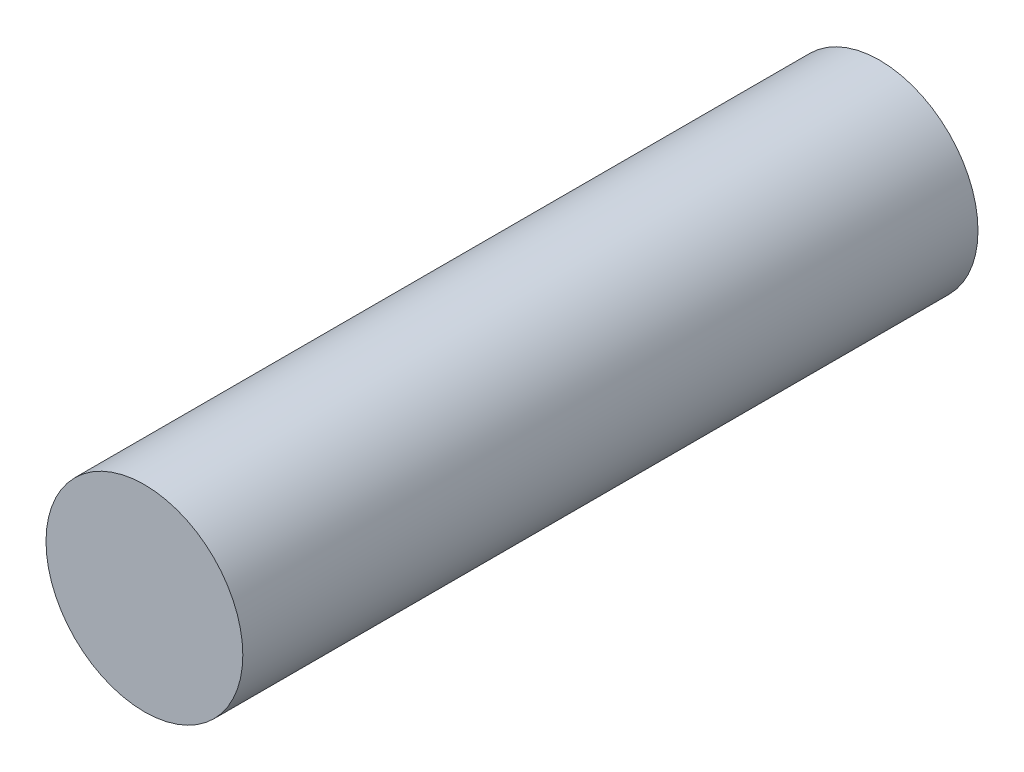
ISO-10303-21;
HEADER;
FILE_DESCRIPTION(('STEP AP214'),'2;1');
FILE_NAME('part.step','',(''),(''),'','','');
FILE_SCHEMA(('AUTOMOTIVE_DESIGN { 1 0 10303 214 1 1 1 1 }'));
ENDSEC;
DATA;
#1=APPLICATION_CONTEXT('core data for automotive mechanical design processes');
#2=APPLICATION_PROTOCOL_DEFINITION('international standard','automotive_design',2000,#1);
#3=PRODUCT_CONTEXT('',#1,'mechanical');
#4=PRODUCT('Part','Part','',(#3));
#5=PRODUCT_RELATED_PRODUCT_CATEGORY('part','',(#4));
#6=PRODUCT_DEFINITION_FORMATION('','',#4);
#7=PRODUCT_DEFINITION_CONTEXT('part definition',#1,'design');
#8=PRODUCT_DEFINITION('design','',#6,#7);
#9=PRODUCT_DEFINITION_SHAPE('','',#8);
#10=(LENGTH_UNIT() NAMED_UNIT(*) SI_UNIT(.MILLI.,.METRE.));
#11=(NAMED_UNIT(*) PLANE_ANGLE_UNIT() SI_UNIT($,.RADIAN.));
#12=(NAMED_UNIT(*) SI_UNIT($,.STERADIAN.) SOLID_ANGLE_UNIT());
#13=UNCERTAINTY_MEASURE_WITH_UNIT(LENGTH_MEASURE(1.E-05),#10,'distance_accuracy_value','');
#14=(GEOMETRIC_REPRESENTATION_CONTEXT(3) GLOBAL_UNCERTAINTY_ASSIGNED_CONTEXT((#13)) GLOBAL_UNIT_ASSIGNED_CONTEXT((#10,
#11,#12)) REPRESENTATION_CONTEXT('',''));
#15=CARTESIAN_POINT('',(0.,0.,0.));
#16=DIRECTION('',(0.,0.,1.));
#17=DIRECTION('',(1.,0.,0.));
#18=AXIS2_PLACEMENT_3D('',#15,#16,#17);
#19=CARTESIAN_POINT('',(0.,0.,63.5));
#20=DIRECTION('',(0.,0.,-1.));
#21=DIRECTION('',(-1.,0.,0.));
#22=AXIS2_PLACEMENT_3D('',#19,#20,#21);
#23=CYLINDRICAL_SURFACE('',#22,8.5);
#24=CARTESIAN_POINT('',(0.,0.,63.5));
#25=DIRECTION('',(0.,0.,1.));
#26=DIRECTION('',(1.,0.,0.));
#27=AXIS2_PLACEMENT_3D('',#24,#25,#26);
#28=CIRCLE('',#27,8.5);
#29=CARTESIAN_POINT('',(8.5,0.,63.5));
#30=VERTEX_POINT('',#29);
#31=EDGE_CURVE('E10',#30,#30,#28,.T.);
#32=ORIENTED_EDGE('',*,*,#31,.F.);
#33=EDGE_LOOP('',(#32));
#34=FACE_BOUND('',#33,.T.);
#35=CARTESIAN_POINT('',(0.,0.,0.));
#36=DIRECTION('',(0.,0.,1.));
#37=DIRECTION('',(1.,0.,0.));
#38=AXIS2_PLACEMENT_3D('',#35,#36,#37);
#39=CIRCLE('',#38,8.5);
#40=CARTESIAN_POINT('',(8.5,0.,0.));
#41=VERTEX_POINT('',#40);
#42=EDGE_CURVE('E34',#41,#41,#39,.T.);
#43=ORIENTED_EDGE('',*,*,#42,.T.);
#44=EDGE_LOOP('',(#43));
#45=FACE_BOUND('',#44,.T.);
#46=ADVANCED_FACE('F31',(#34,#45),#23,.T.);
#47=CARTESIAN_POINT('',(0.,0.,63.5));
#48=DIRECTION('',(0.,0.,1.));
#49=DIRECTION('',(1.,0.,0.));
#50=AXIS2_PLACEMENT_3D('',#47,#48,#49);
#51=PLANE('',#50);
#52=ORIENTED_EDGE('',*,*,#31,.T.);
#53=EDGE_LOOP('',(#52));
#54=FACE_BOUND('',#53,.T.);
#55=ADVANCED_FACE('F46',(#54),#51,.T.);
#56=CARTESIAN_POINT('',(0.,0.,0.));
#57=DIRECTION('',(0.,0.,1.));
#58=DIRECTION('',(1.,0.,0.));
#59=AXIS2_PLACEMENT_3D('',#56,#57,#58);
#60=PLANE('',#59);
#61=ORIENTED_EDGE('',*,*,#42,.F.);
#62=EDGE_LOOP('',(#61));
#63=FACE_BOUND('',#62,.T.);
#64=ADVANCED_FACE('F44',(#63),#60,.F.);
#65=CLOSED_SHELL('',(#46,#55,#64));
#66=MANIFOLD_SOLID_BREP('B2',#65);
#67=ADVANCED_BREP_SHAPE_REPRESENTATION('',(#18,#66),#14);
#68=SHAPE_DEFINITION_REPRESENTATION(#9,#67);
ENDSEC;
END-ISO-10303-21;
